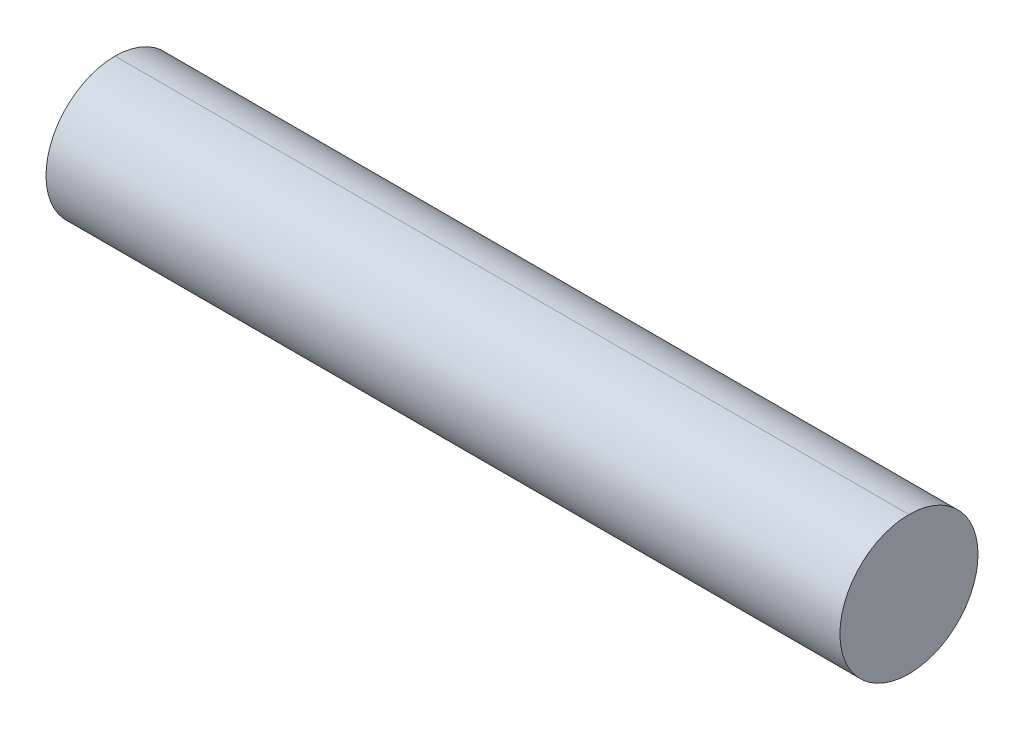
ISO-10303-21;
HEADER;
FILE_DESCRIPTION(('STEP AP214'),'2;1');
FILE_NAME('part.step','',(''),(''),'','','');
FILE_SCHEMA(('AUTOMOTIVE_DESIGN { 1 0 10303 214 1 1 1 1 }'));
ENDSEC;
DATA;
#1=APPLICATION_CONTEXT('core data for automotive mechanical design processes');
#2=APPLICATION_PROTOCOL_DEFINITION('international standard','automotive_design',2000,#1);
#3=PRODUCT_CONTEXT('',#1,'mechanical');
#4=PRODUCT('Part','Part','',(#3));
#5=PRODUCT_RELATED_PRODUCT_CATEGORY('part','',(#4));
#6=PRODUCT_DEFINITION_FORMATION('','',#4);
#7=PRODUCT_DEFINITION_CONTEXT('part definition',#1,'design');
#8=PRODUCT_DEFINITION('design','',#6,#7);
#9=PRODUCT_DEFINITION_SHAPE('','',#8);
#10=(LENGTH_UNIT() NAMED_UNIT(*) SI_UNIT(.MILLI.,.METRE.));
#11=(NAMED_UNIT(*) PLANE_ANGLE_UNIT() SI_UNIT($,.RADIAN.));
#12=(NAMED_UNIT(*) SI_UNIT($,.STERADIAN.) SOLID_ANGLE_UNIT());
#13=UNCERTAINTY_MEASURE_WITH_UNIT(LENGTH_MEASURE(1.E-05),#10,'distance_accuracy_value','');
#14=(GEOMETRIC_REPRESENTATION_CONTEXT(3) GLOBAL_UNCERTAINTY_ASSIGNED_CONTEXT((#13)) GLOBAL_UNIT_ASSIGNED_CONTEXT((#10,
#11,#12)) REPRESENTATION_CONTEXT('',''));
#15=CARTESIAN_POINT('',(0.,0.,0.));
#16=DIRECTION('',(0.,0.,1.));
#17=DIRECTION('',(1.,0.,0.));
#18=AXIS2_PLACEMENT_3D('',#15,#16,#17);
#19=CARTESIAN_POINT('',(146.05,0.,0.));
#20=DIRECTION('',(-1.,0.,0.));
#21=DIRECTION('',(0.,0.,1.));
#22=AXIS2_PLACEMENT_3D('',#19,#20,#21);
#23=CYLINDRICAL_SURFACE('',#22,12.7);
#24=CARTESIAN_POINT('',(146.05,0.,0.));
#25=DIRECTION('',(1.,0.,0.));
#26=DIRECTION('',(0.,0.,-1.));
#27=AXIS2_PLACEMENT_3D('',#24,#25,#26);
#28=CIRCLE('',#27,12.7);
#29=CARTESIAN_POINT('',(146.05,-12.7,0.));
#30=VERTEX_POINT('',#29);
#31=CARTESIAN_POINT('',(146.05,12.7,0.));
#32=VERTEX_POINT('',#31);
#33=EDGE_CURVE('E63',#30,#32,#28,.T.);
#34=ORIENTED_EDGE('',*,*,#33,.F.);
#35=DIRECTION('',(-1.,0.,0.));
#36=VECTOR('',#35,1.);
#37=CARTESIAN_POINT('',(146.05,-12.7,0.));
#38=LINE('',#37,#36);
#39=CARTESIAN_POINT('',(0.,-12.7,0.));
#40=VERTEX_POINT('',#39);
#41=EDGE_CURVE('E11',#30,#40,#38,.T.);
#42=ORIENTED_EDGE('',*,*,#41,.T.);
#43=CARTESIAN_POINT('',(0.,0.,0.));
#44=DIRECTION('',(1.,0.,0.));
#45=DIRECTION('',(0.,0.,-1.));
#46=AXIS2_PLACEMENT_3D('',#43,#44,#45);
#47=CIRCLE('',#46,12.7);
#48=CARTESIAN_POINT('',(0.,12.7,0.));
#49=VERTEX_POINT('',#48);
#50=EDGE_CURVE('E70',#40,#49,#47,.T.);
#51=ORIENTED_EDGE('',*,*,#50,.T.);
#52=DIRECTION('',(1.,0.,0.));
#53=VECTOR('',#52,1.);
#54=CARTESIAN_POINT('',(146.05,12.7,0.));
#55=LINE('',#54,#53);
#56=EDGE_CURVE('E46',#49,#32,#55,.T.);
#57=ORIENTED_EDGE('',*,*,#56,.T.);
#58=EDGE_LOOP('',(#34,#42,#51,#57));
#59=FACE_BOUND('',#58,.T.);
#60=ADVANCED_FACE('F37',(#59),#23,.T.);
#61=ORIENTED_EDGE('',*,*,#41,.F.);
#62=EDGE_CURVE('E66',#32,#30,#28,.T.);
#63=ORIENTED_EDGE('',*,*,#62,.F.);
#64=ORIENTED_EDGE('',*,*,#56,.F.);
#65=EDGE_CURVE('E67',#49,#40,#47,.T.);
#66=ORIENTED_EDGE('',*,*,#65,.T.);
#67=EDGE_LOOP('',(#61,#63,#64,#66));
#68=FACE_BOUND('',#67,.T.);
#69=ADVANCED_FACE('F39',(#68),#23,.T.);
#70=CARTESIAN_POINT('',(146.05,0.,0.));
#71=DIRECTION('',(1.,0.,0.));
#72=DIRECTION('',(0.,0.,-1.));
#73=AXIS2_PLACEMENT_3D('',#70,#71,#72);
#74=PLANE('',#73);
#75=ORIENTED_EDGE('',*,*,#62,.T.);
#76=ORIENTED_EDGE('',*,*,#33,.T.);
#77=EDGE_LOOP('',(#75,#76));
#78=FACE_BOUND('',#77,.T.);
#79=ADVANCED_FACE('F65',(#78),#74,.T.);
#80=CARTESIAN_POINT('',(0.,0.,0.));
#81=DIRECTION('',(1.,0.,0.));
#82=DIRECTION('',(0.,0.,-1.));
#83=AXIS2_PLACEMENT_3D('',#80,#81,#82);
#84=PLANE('',#83);
#85=ORIENTED_EDGE('',*,*,#65,.F.);
#86=ORIENTED_EDGE('',*,*,#50,.F.);
#87=EDGE_LOOP('',(#85,#86));
#88=FACE_BOUND('',#87,.T.);
#89=ADVANCED_FACE('F75',(#88),#84,.F.);
#90=CLOSED_SHELL('',(#60,#69,#79,#89));
#91=MANIFOLD_SOLID_BREP('B2',#90);
#92=ADVANCED_BREP_SHAPE_REPRESENTATION('',(#18,#91),#14);
#93=SHAPE_DEFINITION_REPRESENTATION(#9,#92);
ENDSEC;
END-ISO-10303-21;
